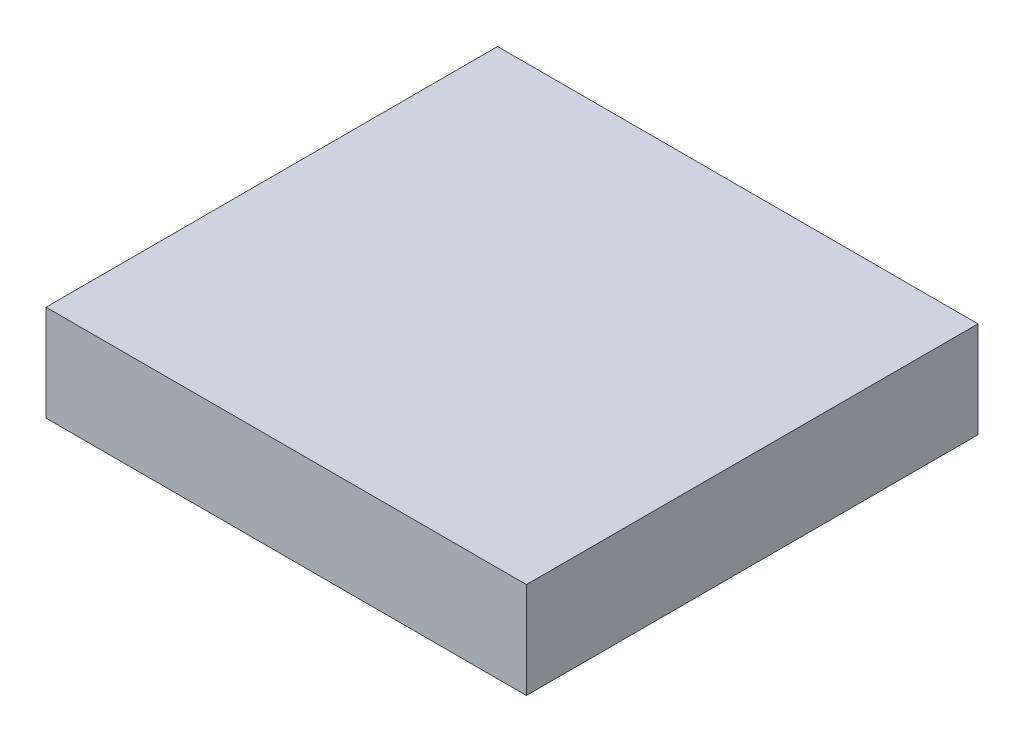
ISO-10303-21;
HEADER;
FILE_DESCRIPTION(('STEP AP214'),'2;1');
FILE_NAME('part.step','',(''),(''),'','','');
FILE_SCHEMA(('AUTOMOTIVE_DESIGN { 1 0 10303 214 1 1 1 1 }'));
ENDSEC;
DATA;
#1=APPLICATION_CONTEXT('core data for automotive mechanical design processes');
#2=APPLICATION_PROTOCOL_DEFINITION('international standard','automotive_design',2000,#1);
#3=PRODUCT_CONTEXT('',#1,'mechanical');
#4=PRODUCT('Part','Part','',(#3));
#5=PRODUCT_RELATED_PRODUCT_CATEGORY('part','',(#4));
#6=PRODUCT_DEFINITION_FORMATION('','',#4);
#7=PRODUCT_DEFINITION_CONTEXT('part definition',#1,'design');
#8=PRODUCT_DEFINITION('design','',#6,#7);
#9=PRODUCT_DEFINITION_SHAPE('','',#8);
#10=(LENGTH_UNIT() NAMED_UNIT(*) SI_UNIT(.MILLI.,.METRE.));
#11=(NAMED_UNIT(*) PLANE_ANGLE_UNIT() SI_UNIT($,.RADIAN.));
#12=(NAMED_UNIT(*) SI_UNIT($,.STERADIAN.) SOLID_ANGLE_UNIT());
#13=UNCERTAINTY_MEASURE_WITH_UNIT(LENGTH_MEASURE(1.E-05),#10,'distance_accuracy_value','');
#14=(GEOMETRIC_REPRESENTATION_CONTEXT(3) GLOBAL_UNCERTAINTY_ASSIGNED_CONTEXT((#13)) GLOBAL_UNIT_ASSIGNED_CONTEXT((#10,
#11,#12)) REPRESENTATION_CONTEXT('',''));
#15=CARTESIAN_POINT('',(0.,0.,0.));
#16=DIRECTION('',(0.,0.,1.));
#17=DIRECTION('',(1.,0.,0.));
#18=AXIS2_PLACEMENT_3D('',#15,#16,#17);
#19=CARTESIAN_POINT('',(50.,20.,-47.));
#20=DIRECTION('',(-1.,0.,0.));
#21=DIRECTION('',(0.,0.,1.));
#22=AXIS2_PLACEMENT_3D('',#19,#20,#21);
#23=PLANE('',#22);
#24=DIRECTION('',(0.,0.,-1.));
#25=VECTOR('',#24,1.);
#26=CARTESIAN_POINT('',(50.,0.,-47.));
#27=LINE('',#26,#25);
#28=CARTESIAN_POINT('',(50.,0.,47.));
#29=VERTEX_POINT('',#28);
#30=CARTESIAN_POINT('',(50.,0.,-47.));
#31=VERTEX_POINT('',#30);
#32=EDGE_CURVE('E96',#29,#31,#27,.T.);
#33=ORIENTED_EDGE('',*,*,#32,.T.);
#34=DIRECTION('',(0.,-1.,0.));
#35=VECTOR('',#34,1.);
#36=CARTESIAN_POINT('',(50.,20.,-47.));
#37=LINE('',#36,#35);
#38=CARTESIAN_POINT('',(50.,20.,-47.));
#39=VERTEX_POINT('',#38);
#40=EDGE_CURVE('E11',#39,#31,#37,.T.);
#41=ORIENTED_EDGE('',*,*,#40,.F.);
#42=DIRECTION('',(0.,0.,-1.));
#43=VECTOR('',#42,1.);
#44=CARTESIAN_POINT('',(50.,20.,-47.));
#45=LINE('',#44,#43);
#46=CARTESIAN_POINT('',(50.,20.,47.));
#47=VERTEX_POINT('',#46);
#48=EDGE_CURVE('E84',#47,#39,#45,.T.);
#49=ORIENTED_EDGE('',*,*,#48,.F.);
#50=DIRECTION('',(0.,-1.,0.));
#51=VECTOR('',#50,1.);
#52=CARTESIAN_POINT('',(50.,20.,47.));
#53=LINE('',#52,#51);
#54=EDGE_CURVE('E92',#47,#29,#53,.T.);
#55=ORIENTED_EDGE('',*,*,#54,.T.);
#56=EDGE_LOOP('',(#33,#41,#49,#55));
#57=FACE_BOUND('',#56,.T.);
#58=ADVANCED_FACE('F33',(#57),#23,.F.);
#59=CARTESIAN_POINT('',(-50.,20.,-47.));
#60=DIRECTION('',(0.,0.,1.));
#61=DIRECTION('',(1.,0.,0.));
#62=AXIS2_PLACEMENT_3D('',#59,#60,#61);
#63=PLANE('',#62);
#64=DIRECTION('',(-1.,0.,0.));
#65=VECTOR('',#64,1.);
#66=CARTESIAN_POINT('',(-50.,0.,-47.));
#67=LINE('',#66,#65);
#68=CARTESIAN_POINT('',(-50.,0.,-47.));
#69=VERTEX_POINT('',#68);
#70=EDGE_CURVE('E88',#31,#69,#67,.T.);
#71=ORIENTED_EDGE('',*,*,#70,.T.);
#72=DIRECTION('',(0.,-1.,0.));
#73=VECTOR('',#72,1.);
#74=CARTESIAN_POINT('',(-50.,20.,-47.));
#75=LINE('',#74,#73);
#76=CARTESIAN_POINT('',(-50.,20.,-47.));
#77=VERTEX_POINT('',#76);
#78=EDGE_CURVE('E41',#77,#69,#75,.T.);
#79=ORIENTED_EDGE('',*,*,#78,.F.);
#80=DIRECTION('',(-1.,0.,0.));
#81=VECTOR('',#80,1.);
#82=CARTESIAN_POINT('',(-50.,20.,-47.));
#83=LINE('',#82,#81);
#84=EDGE_CURVE('E79',#39,#77,#83,.T.);
#85=ORIENTED_EDGE('',*,*,#84,.F.);
#86=ORIENTED_EDGE('',*,*,#40,.T.);
#87=EDGE_LOOP('',(#71,#79,#85,#86));
#88=FACE_BOUND('',#87,.T.);
#89=ADVANCED_FACE('F87',(#88),#63,.F.);
#90=CARTESIAN_POINT('',(-50.,20.,-47.));
#91=DIRECTION('',(1.,0.,0.));
#92=DIRECTION('',(0.,0.,-1.));
#93=AXIS2_PLACEMENT_3D('',#90,#91,#92);
#94=PLANE('',#93);
#95=DIRECTION('',(0.,0.,1.));
#96=VECTOR('',#95,1.);
#97=CARTESIAN_POINT('',(-50.,0.,-47.));
#98=LINE('',#97,#96);
#99=CARTESIAN_POINT('',(-50.,0.,47.));
#100=VERTEX_POINT('',#99);
#101=EDGE_CURVE('E66',#69,#100,#98,.T.);
#102=ORIENTED_EDGE('',*,*,#101,.T.);
#103=DIRECTION('',(0.,-1.,0.));
#104=VECTOR('',#103,1.);
#105=CARTESIAN_POINT('',(-50.,20.,47.));
#106=LINE('',#105,#104);
#107=CARTESIAN_POINT('',(-50.,20.,47.));
#108=VERTEX_POINT('',#107);
#109=EDGE_CURVE('E89',#108,#100,#106,.T.);
#110=ORIENTED_EDGE('',*,*,#109,.F.);
#111=DIRECTION('',(0.,0.,1.));
#112=VECTOR('',#111,1.);
#113=CARTESIAN_POINT('',(-50.,20.,-47.));
#114=LINE('',#113,#112);
#115=EDGE_CURVE('E82',#77,#108,#114,.T.);
#116=ORIENTED_EDGE('',*,*,#115,.F.);
#117=ORIENTED_EDGE('',*,*,#78,.T.);
#118=EDGE_LOOP('',(#102,#110,#116,#117));
#119=FACE_BOUND('',#118,.T.);
#120=ADVANCED_FACE('F90',(#119),#94,.F.);
#121=CARTESIAN_POINT('',(-50.,20.,47.));
#122=DIRECTION('',(0.,0.,-1.));
#123=DIRECTION('',(-1.,0.,0.));
#124=AXIS2_PLACEMENT_3D('',#121,#122,#123);
#125=PLANE('',#124);
#126=DIRECTION('',(1.,0.,0.));
#127=VECTOR('',#126,1.);
#128=CARTESIAN_POINT('',(-50.,0.,47.));
#129=LINE('',#128,#127);
#130=EDGE_CURVE('E72',#100,#29,#129,.T.);
#131=ORIENTED_EDGE('',*,*,#130,.T.);
#132=ORIENTED_EDGE('',*,*,#54,.F.);
#133=DIRECTION('',(1.,0.,0.));
#134=VECTOR('',#133,1.);
#135=CARTESIAN_POINT('',(-50.,20.,47.));
#136=LINE('',#135,#134);
#137=EDGE_CURVE('E49',#108,#47,#136,.T.);
#138=ORIENTED_EDGE('',*,*,#137,.F.);
#139=ORIENTED_EDGE('',*,*,#109,.T.);
#140=EDGE_LOOP('',(#131,#132,#138,#139));
#141=FACE_BOUND('',#140,.T.);
#142=ADVANCED_FACE('F103',(#141),#125,.F.);
#143=CARTESIAN_POINT('',(0.,20.,0.));
#144=DIRECTION('',(0.,1.,0.));
#145=DIRECTION('',(0.,0.,1.));
#146=AXIS2_PLACEMENT_3D('',#143,#144,#145);
#147=PLANE('',#146);
#148=ORIENTED_EDGE('',*,*,#48,.T.);
#149=ORIENTED_EDGE('',*,*,#84,.T.);
#150=ORIENTED_EDGE('',*,*,#115,.T.);
#151=ORIENTED_EDGE('',*,*,#137,.T.);
#152=EDGE_LOOP('',(#148,#149,#150,#151));
#153=FACE_BOUND('',#152,.T.);
#154=ADVANCED_FACE('F80',(#153),#147,.T.);
#155=CARTESIAN_POINT('',(0.,0.,0.));
#156=DIRECTION('',(0.,1.,0.));
#157=DIRECTION('',(0.,0.,1.));
#158=AXIS2_PLACEMENT_3D('',#155,#156,#157);
#159=PLANE('',#158);
#160=ORIENTED_EDGE('',*,*,#32,.F.);
#161=ORIENTED_EDGE('',*,*,#130,.F.);
#162=ORIENTED_EDGE('',*,*,#101,.F.);
#163=ORIENTED_EDGE('',*,*,#70,.F.);
#164=EDGE_LOOP('',(#160,#161,#162,#163));
#165=FACE_BOUND('',#164,.T.);
#166=ADVANCED_FACE('F106',(#165),#159,.F.);
#167=CLOSED_SHELL('',(#58,#89,#120,#142,#154,#166));
#168=MANIFOLD_SOLID_BREP('B2',#167);
#169=ADVANCED_BREP_SHAPE_REPRESENTATION('',(#18,#168),#14);
#170=SHAPE_DEFINITION_REPRESENTATION(#9,#169);
ENDSEC;
END-ISO-10303-21;
